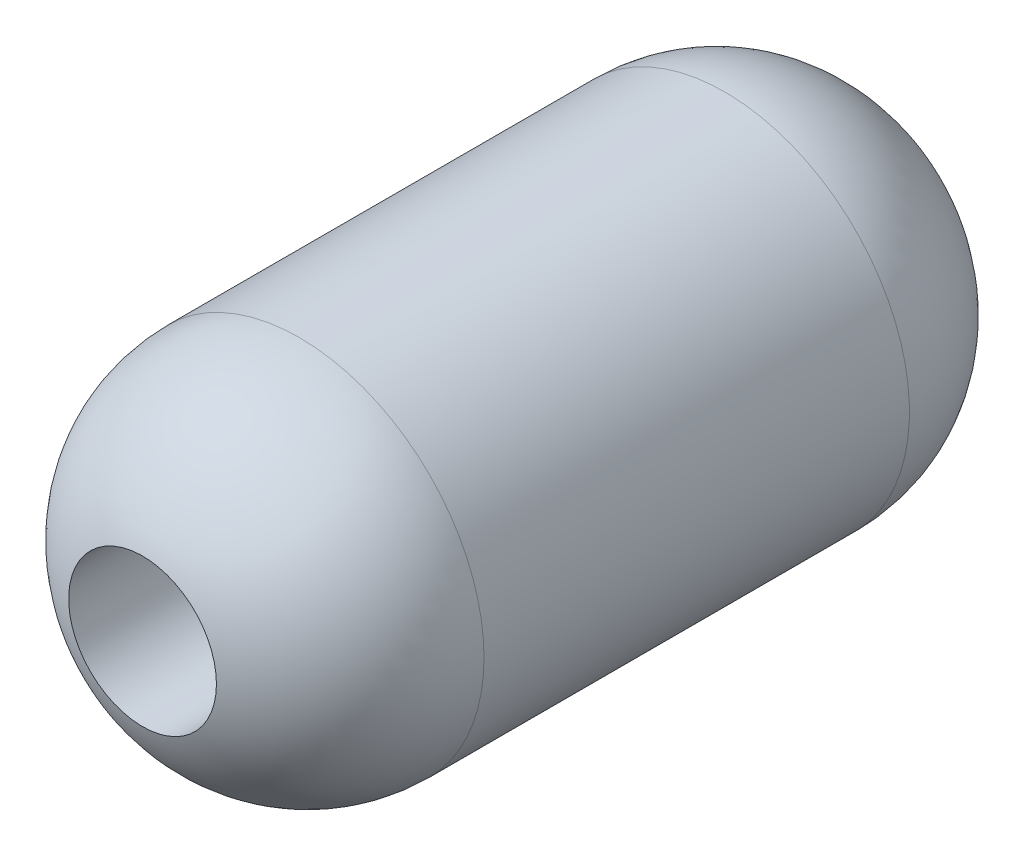
ISO-10303-21;
HEADER;
FILE_DESCRIPTION(('STEP AP214'),'2;1');
FILE_NAME('part.step','',(''),(''),'','','');
FILE_SCHEMA(('AUTOMOTIVE_DESIGN { 1 0 10303 214 1 1 1 1 }'));
ENDSEC;
DATA;
#1=APPLICATION_CONTEXT('core data for automotive mechanical design processes');
#2=APPLICATION_PROTOCOL_DEFINITION('international standard','automotive_design',2000,#1);
#3=PRODUCT_CONTEXT('',#1,'mechanical');
#4=PRODUCT('Part','Part','',(#3));
#5=PRODUCT_RELATED_PRODUCT_CATEGORY('part','',(#4));
#6=PRODUCT_DEFINITION_FORMATION('','',#4);
#7=PRODUCT_DEFINITION_CONTEXT('part definition',#1,'design');
#8=PRODUCT_DEFINITION('design','',#6,#7);
#9=PRODUCT_DEFINITION_SHAPE('','',#8);
#10=(LENGTH_UNIT() NAMED_UNIT(*) SI_UNIT(.MILLI.,.METRE.));
#11=(NAMED_UNIT(*) PLANE_ANGLE_UNIT() SI_UNIT($,.RADIAN.));
#12=(NAMED_UNIT(*) SI_UNIT($,.STERADIAN.) SOLID_ANGLE_UNIT());
#13=UNCERTAINTY_MEASURE_WITH_UNIT(LENGTH_MEASURE(1.E-05),#10,'distance_accuracy_value','');
#14=(GEOMETRIC_REPRESENTATION_CONTEXT(3) GLOBAL_UNCERTAINTY_ASSIGNED_CONTEXT((#13)) GLOBAL_UNIT_ASSIGNED_CONTEXT((#10,
#11,#12)) REPRESENTATION_CONTEXT('',''));
#15=CARTESIAN_POINT('',(0.,0.,0.));
#16=DIRECTION('',(0.,0.,1.));
#17=DIRECTION('',(1.,0.,0.));
#18=AXIS2_PLACEMENT_3D('',#15,#16,#17);
#19=CARTESIAN_POINT('',(0.,0.,20.));
#20=DIRECTION('',(0.,0.,-1.));
#21=DIRECTION('',(-1.,0.,0.));
#22=AXIS2_PLACEMENT_3D('',#19,#20,#21);
#23=CYLINDRICAL_SURFACE('',#22,5.);
#24=CARTESIAN_POINT('',(0.,0.,4.24264068711929));
#25=DIRECTION('',(0.,0.,-1.));
#26=DIRECTION('',(-1.,0.,0.));
#27=AXIS2_PLACEMENT_3D('',#24,#25,#26);
#28=CIRCLE('',#27,5.);
#29=CARTESIAN_POINT('',(-5.,0.,4.24264068711929));
#30=VERTEX_POINT('',#29);
#31=EDGE_CURVE('E10',#30,#30,#28,.F.);
#32=ORIENTED_EDGE('',*,*,#31,.T.);
#33=EDGE_LOOP('',(#32));
#34=FACE_BOUND('',#33,.T.);
#35=CARTESIAN_POINT('',(0.,0.,15.7573593128807));
#36=DIRECTION('',(0.,0.,1.));
#37=DIRECTION('',(1.,0.,0.));
#38=AXIS2_PLACEMENT_3D('',#35,#36,#37);
#39=CIRCLE('',#38,5.);
#40=CARTESIAN_POINT('',(5.,0.,15.7573593128807));
#41=VERTEX_POINT('',#40);
#42=EDGE_CURVE('E22',#41,#41,#39,.F.);
#43=ORIENTED_EDGE('',*,*,#42,.T.);
#44=EDGE_LOOP('',(#43));
#45=FACE_BOUND('',#44,.T.);
#46=ADVANCED_FACE('F15',(#34,#45),#23,.T.);
#47=CARTESIAN_POINT('',(0.,0.,20.));
#48=DIRECTION('',(0.,0.,-1.));
#49=DIRECTION('',(-1.,0.,0.));
#50=AXIS2_PLACEMENT_3D('',#47,#48,#49);
#51=CYLINDRICAL_SURFACE('',#50,2.);
#52=CARTESIAN_POINT('',(0.,0.,20.));
#53=DIRECTION('',(0.,0.,1.));
#54=DIRECTION('',(1.,0.,0.));
#55=AXIS2_PLACEMENT_3D('',#52,#53,#54);
#56=CIRCLE('',#55,2.);
#57=CARTESIAN_POINT('',(2.,0.,20.));
#58=VERTEX_POINT('',#57);
#59=EDGE_CURVE('E26',#58,#58,#56,.T.);
#60=ORIENTED_EDGE('',*,*,#59,.T.);
#61=EDGE_LOOP('',(#60));
#62=FACE_BOUND('',#61,.T.);
#63=CARTESIAN_POINT('',(0.,0.,0.));
#64=DIRECTION('',(0.,0.,1.));
#65=DIRECTION('',(1.,0.,0.));
#66=AXIS2_PLACEMENT_3D('',#63,#64,#65);
#67=CIRCLE('',#66,2.);
#68=CARTESIAN_POINT('',(2.,0.,0.));
#69=VERTEX_POINT('',#68);
#70=EDGE_CURVE('E30',#69,#69,#67,.T.);
#71=ORIENTED_EDGE('',*,*,#70,.F.);
#72=EDGE_LOOP('',(#71));
#73=FACE_BOUND('',#72,.T.);
#74=ADVANCED_FACE('F39',(#62,#73),#51,.F.);
#75=CARTESIAN_POINT('',(0.,0.,4.24264068711928));
#76=DIRECTION('',(0.,0.,-1.));
#77=DIRECTION('',(-1.,0.,0.));
#78=AXIS2_PLACEMENT_3D('',#75,#76,#77);
#79=DEGENERATE_TOROIDAL_SURFACE('',#78,0.5,4.5,.T.);
#80=ORIENTED_EDGE('',*,*,#70,.T.);
#81=EDGE_LOOP('',(#80));
#82=FACE_BOUND('',#81,.T.);
#83=ORIENTED_EDGE('',*,*,#31,.F.);
#84=EDGE_LOOP('',(#83));
#85=FACE_BOUND('',#84,.T.);
#86=ADVANCED_FACE('F36',(#82,#85),#79,.T.);
#87=CARTESIAN_POINT('',(0.,0.,15.7573593128807));
#88=DIRECTION('',(0.,0.,1.));
#89=DIRECTION('',(1.,0.,0.));
#90=AXIS2_PLACEMENT_3D('',#87,#88,#89);
#91=DEGENERATE_TOROIDAL_SURFACE('',#90,0.5,4.5,.T.);
#92=ORIENTED_EDGE('',*,*,#42,.F.);
#93=EDGE_LOOP('',(#92));
#94=FACE_BOUND('',#93,.T.);
#95=ORIENTED_EDGE('',*,*,#59,.F.);
#96=EDGE_LOOP('',(#95));
#97=FACE_BOUND('',#96,.T.);
#98=ADVANCED_FACE('F17',(#94,#97),#91,.T.);
#99=CLOSED_SHELL('',(#46,#74,#86,#98));
#100=MANIFOLD_SOLID_BREP('B1',#99);
#101=ADVANCED_BREP_SHAPE_REPRESENTATION('',(#18,#100),#14);
#102=SHAPE_DEFINITION_REPRESENTATION(#9,#101);
ENDSEC;
END-ISO-10303-21;
